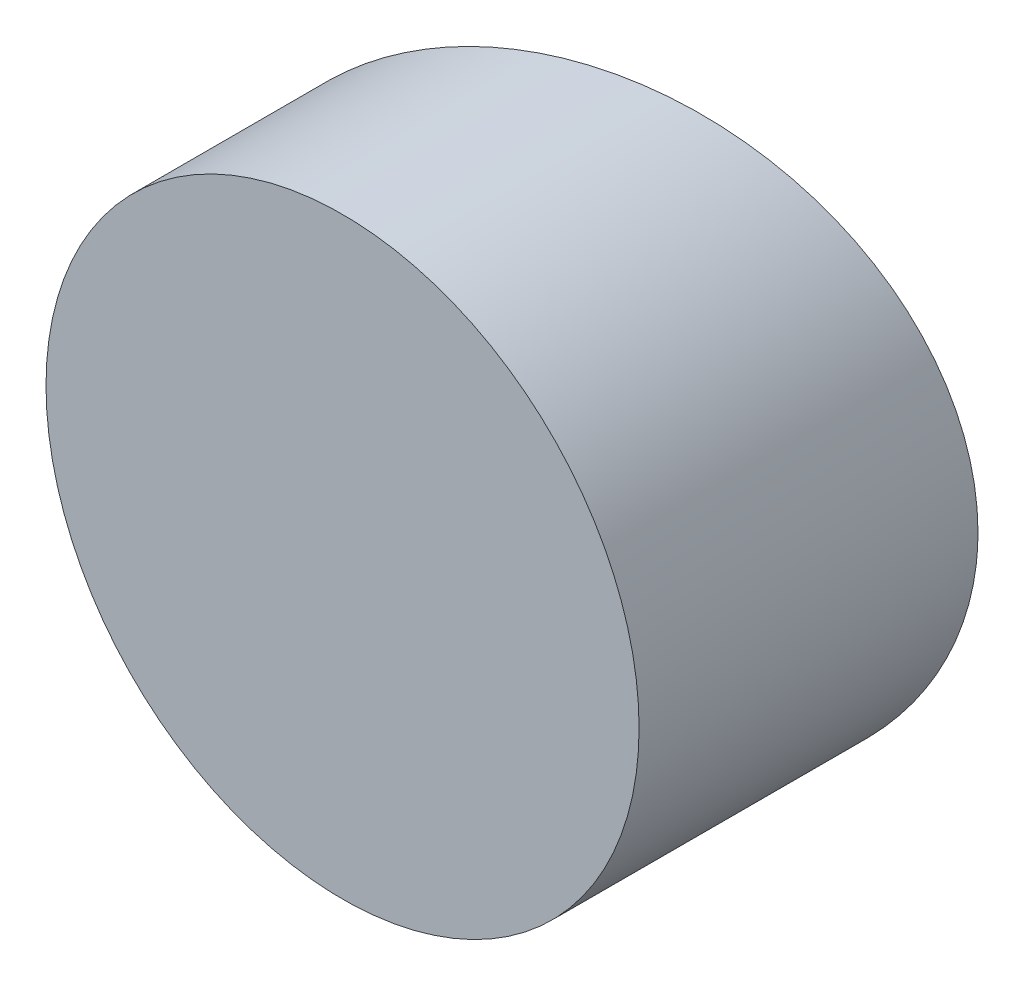
ISO-10303-21;
HEADER;
FILE_DESCRIPTION(('STEP AP214'),'2;1');
FILE_NAME('part.step','',(''),(''),'','','');
FILE_SCHEMA(('AUTOMOTIVE_DESIGN { 1 0 10303 214 1 1 1 1 }'));
ENDSEC;
DATA;
#1=APPLICATION_CONTEXT('core data for automotive mechanical design processes');
#2=APPLICATION_PROTOCOL_DEFINITION('international standard','automotive_design',2000,#1);
#3=PRODUCT_CONTEXT('',#1,'mechanical');
#4=PRODUCT('Part','Part','',(#3));
#5=PRODUCT_RELATED_PRODUCT_CATEGORY('part','',(#4));
#6=PRODUCT_DEFINITION_FORMATION('','',#4);
#7=PRODUCT_DEFINITION_CONTEXT('part definition',#1,'design');
#8=PRODUCT_DEFINITION('design','',#6,#7);
#9=PRODUCT_DEFINITION_SHAPE('','',#8);
#10=(LENGTH_UNIT() NAMED_UNIT(*) SI_UNIT(.MILLI.,.METRE.));
#11=(NAMED_UNIT(*) PLANE_ANGLE_UNIT() SI_UNIT($,.RADIAN.));
#12=(NAMED_UNIT(*) SI_UNIT($,.STERADIAN.) SOLID_ANGLE_UNIT());
#13=UNCERTAINTY_MEASURE_WITH_UNIT(LENGTH_MEASURE(1.E-05),#10,'distance_accuracy_value','');
#14=(GEOMETRIC_REPRESENTATION_CONTEXT(3) GLOBAL_UNCERTAINTY_ASSIGNED_CONTEXT((#13)) GLOBAL_UNIT_ASSIGNED_CONTEXT((#10,
#11,#12)) REPRESENTATION_CONTEXT('',''));
#15=CARTESIAN_POINT('',(0.,0.,0.));
#16=DIRECTION('',(0.,0.,1.));
#17=DIRECTION('',(1.,0.,0.));
#18=AXIS2_PLACEMENT_3D('',#15,#16,#17);
#19=CARTESIAN_POINT('',(1.62587097849642,0.,16.));
#20=DIRECTION('',(0.,0.,-1.));
#21=DIRECTION('',(-1.,0.,0.));
#22=AXIS2_PLACEMENT_3D('',#19,#20,#21);
#23=CYLINDRICAL_SURFACE('',#22,14.);
#24=CARTESIAN_POINT('',(1.62587097849642,0.,16.));
#25=DIRECTION('',(0.,0.,1.));
#26=DIRECTION('',(1.,0.,0.));
#27=AXIS2_PLACEMENT_3D('',#24,#25,#26);
#28=CIRCLE('',#27,14.);
#29=CARTESIAN_POINT('',(15.6258709784964,0.,16.));
#30=VERTEX_POINT('',#29);
#31=EDGE_CURVE('E10',#30,#30,#28,.T.);
#32=ORIENTED_EDGE('',*,*,#31,.F.);
#33=EDGE_LOOP('',(#32));
#34=FACE_BOUND('',#33,.T.);
#35=CARTESIAN_POINT('',(1.62587097849642,0.,4.));
#36=DIRECTION('',(0.274721127897378,0.,0.961523947640823));
#37=DIRECTION('',(0.961523947640823,0.,-0.274721127897378));
#38=AXIS2_PLACEMENT_3D('',#35,#36,#37);
#39=ELLIPSE('',#38,14.560219778561,14.);
#40=CARTESIAN_POINT('',(15.6258709784964,0.,0.));
#41=VERTEX_POINT('',#40);
#42=EDGE_CURVE('E41',#41,#41,#39,.T.);
#43=ORIENTED_EDGE('',*,*,#42,.T.);
#44=EDGE_LOOP('',(#43));
#45=FACE_BOUND('',#44,.T.);
#46=ADVANCED_FACE('F35',(#34,#45),#23,.T.);
#47=CARTESIAN_POINT('',(1.62587097849642,0.,16.));
#48=DIRECTION('',(0.,0.,1.));
#49=DIRECTION('',(1.,0.,0.));
#50=AXIS2_PLACEMENT_3D('',#47,#48,#49);
#51=PLANE('',#50);
#52=ORIENTED_EDGE('',*,*,#31,.T.);
#53=EDGE_LOOP('',(#52));
#54=FACE_BOUND('',#53,.T.);
#55=ADVANCED_FACE('F50',(#54),#51,.T.);
#56=CARTESIAN_POINT('',(-12.3741290215036,-18.,8.));
#57=DIRECTION('',(0.274721127897378,0.,0.961523947640823));
#58=DIRECTION('',(0.961523947640823,0.,-0.274721127897378));
#59=AXIS2_PLACEMENT_3D('',#56,#57,#58);
#60=PLANE('',#59);
#61=ORIENTED_EDGE('',*,*,#42,.F.);
#62=EDGE_LOOP('',(#61));
#63=FACE_BOUND('',#62,.T.);
#64=ADVANCED_FACE('F48',(#63),#60,.F.);
#65=CLOSED_SHELL('',(#46,#55,#64));
#66=MANIFOLD_SOLID_BREP('B2',#65);
#67=ADVANCED_BREP_SHAPE_REPRESENTATION('',(#18,#66),#14);
#68=SHAPE_DEFINITION_REPRESENTATION(#9,#67);
ENDSEC;
END-ISO-10303-21;
